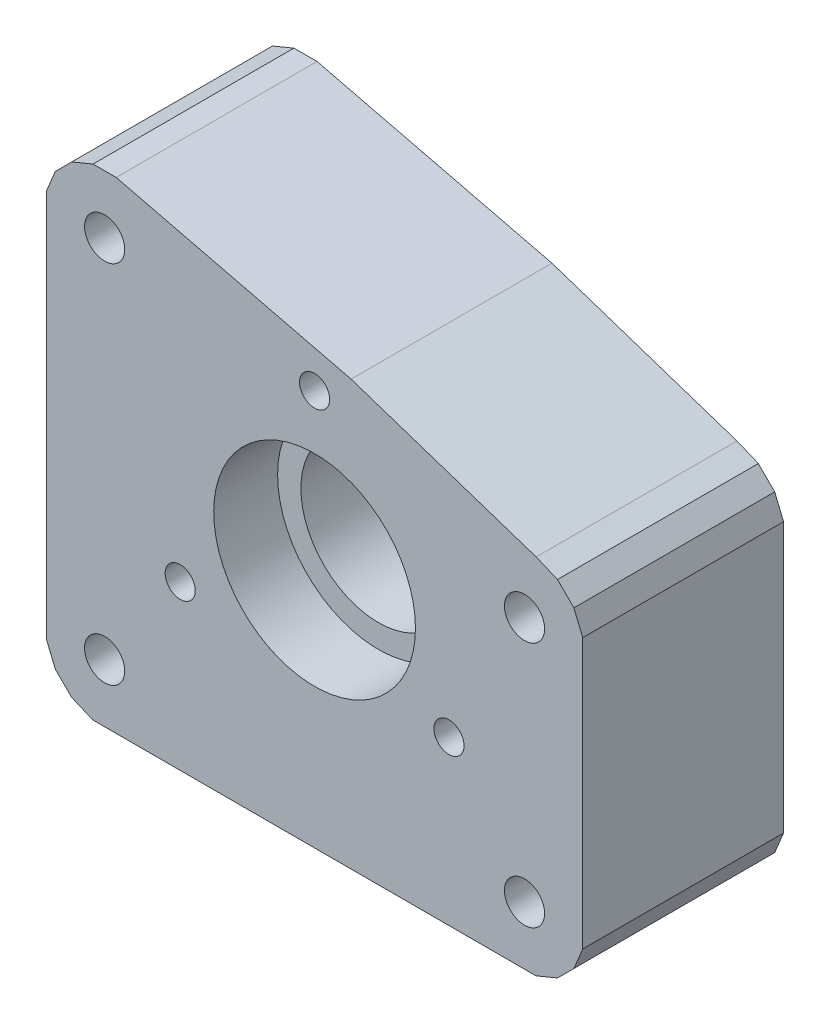
ISO-10303-21;
HEADER;
FILE_DESCRIPTION(('STEP AP214'),'2;1');
FILE_NAME('part.step','',(''),(''),'','','');
FILE_SCHEMA(('AUTOMOTIVE_DESIGN { 1 0 10303 214 1 1 1 1 }'));
ENDSEC;
DATA;
#1=APPLICATION_CONTEXT('core data for automotive mechanical design processes');
#2=APPLICATION_PROTOCOL_DEFINITION('international standard','automotive_design',2000,#1);
#3=PRODUCT_CONTEXT('',#1,'mechanical');
#4=PRODUCT('Part','Part','',(#3));
#5=PRODUCT_RELATED_PRODUCT_CATEGORY('part','',(#4));
#6=PRODUCT_DEFINITION_FORMATION('','',#4);
#7=PRODUCT_DEFINITION_CONTEXT('part definition',#1,'design');
#8=PRODUCT_DEFINITION('design','',#6,#7);
#9=PRODUCT_DEFINITION_SHAPE('','',#8);
#10=(LENGTH_UNIT() NAMED_UNIT(*) SI_UNIT(.MILLI.,.METRE.));
#11=(NAMED_UNIT(*) PLANE_ANGLE_UNIT() SI_UNIT($,.RADIAN.));
#12=(NAMED_UNIT(*) SI_UNIT($,.STERADIAN.) SOLID_ANGLE_UNIT());
#13=UNCERTAINTY_MEASURE_WITH_UNIT(LENGTH_MEASURE(1.E-05),#10,'distance_accuracy_value','');
#14=(GEOMETRIC_REPRESENTATION_CONTEXT(3) GLOBAL_UNCERTAINTY_ASSIGNED_CONTEXT((#13)) GLOBAL_UNIT_ASSIGNED_CONTEXT((#10,
#11,#12)) REPRESENTATION_CONTEXT('',''));
#15=CARTESIAN_POINT('',(0.,0.,0.));
#16=DIRECTION('',(0.,0.,1.));
#17=DIRECTION('',(1.,0.,0.));
#18=AXIS2_PLACEMENT_3D('',#15,#16,#17);
#19=CARTESIAN_POINT('',(0.,0.,56.));
#20=DIRECTION('',(0.,0.,-1.));
#21=DIRECTION('',(-1.,0.,0.));
#22=AXIS2_PLACEMENT_3D('',#19,#20,#21);
#23=CYLINDRICAL_SURFACE('',#22,8.5);
#24=CARTESIAN_POINT('',(0.,0.,41.));
#25=DIRECTION('',(0.,0.,1.));
#26=DIRECTION('',(1.,0.,0.));
#27=AXIS2_PLACEMENT_3D('',#24,#25,#26);
#28=CIRCLE('',#27,8.5);
#29=CARTESIAN_POINT('',(8.5,0.,41.));
#30=VERTEX_POINT('',#29);
#31=EDGE_CURVE('E280',#30,#30,#28,.T.);
#32=ORIENTED_EDGE('',*,*,#31,.F.);
#33=EDGE_LOOP('',(#32));
#34=FACE_BOUND('',#33,.T.);
#35=CARTESIAN_POINT('',(0.,0.,49.));
#36=DIRECTION('',(0.,0.,1.));
#37=DIRECTION('',(1.,0.,0.));
#38=AXIS2_PLACEMENT_3D('',#35,#36,#37);
#39=CIRCLE('',#38,8.5);
#40=CARTESIAN_POINT('',(8.5,0.,49.));
#41=VERTEX_POINT('',#40);
#42=EDGE_CURVE('E287',#41,#41,#39,.T.);
#43=ORIENTED_EDGE('',*,*,#42,.T.);
#44=EDGE_LOOP('',(#43));
#45=FACE_BOUND('',#44,.T.);
#46=ADVANCED_FACE('F43',(#34,#45),#23,.F.);
#47=CARTESIAN_POINT('',(0.,0.,56.));
#48=DIRECTION('',(0.,0.,1.));
#49=DIRECTION('',(1.,0.,0.));
#50=AXIS2_PLACEMENT_3D('',#47,#48,#49);
#51=PLANE('',#50);
#52=CARTESIAN_POINT('',(0.,0.,56.));
#53=DIRECTION('',(0.,0.,1.));
#54=DIRECTION('',(1.,0.,0.));
#55=AXIS2_PLACEMENT_3D('',#52,#53,#54);
#56=CIRCLE('',#55,11.05);
#57=CARTESIAN_POINT('',(11.05,0.,56.));
#58=VERTEX_POINT('',#57);
#59=EDGE_CURVE('E47',#58,#58,#56,.F.);
#60=ORIENTED_EDGE('',*,*,#59,.T.);
#61=EDGE_LOOP('',(#60));
#62=FACE_BOUND('',#61,.T.);
#63=CARTESIAN_POINT('',(14.7224318643355,-8.5,56.));
#64=DIRECTION('',(0.,0.,1.));
#65=DIRECTION('',(1.,0.,0.));
#66=AXIS2_PLACEMENT_3D('',#63,#64,#65);
#67=CIRCLE('',#66,1.65);
#68=CARTESIAN_POINT('',(16.3724318643355,-8.5,56.));
#69=VERTEX_POINT('',#68);
#70=EDGE_CURVE('E306',#69,#69,#67,.T.);
#71=ORIENTED_EDGE('',*,*,#70,.F.);
#72=EDGE_LOOP('',(#71));
#73=FACE_BOUND('',#72,.T.);
#74=CARTESIAN_POINT('',(-23.,20.,56.));
#75=DIRECTION('',(0.,0.,1.));
#76=DIRECTION('',(1.,0.,0.));
#77=AXIS2_PLACEMENT_3D('',#74,#75,#76);
#78=CIRCLE('',#77,2.2);
#79=CARTESIAN_POINT('',(-20.8,20.,56.));
#80=VERTEX_POINT('',#79);
#81=EDGE_CURVE('E318',#80,#80,#78,.T.);
#82=ORIENTED_EDGE('',*,*,#81,.F.);
#83=EDGE_LOOP('',(#82));
#84=FACE_BOUND('',#83,.T.);
#85=CARTESIAN_POINT('',(-23.,-20.,56.));
#86=DIRECTION('',(0.,0.,1.));
#87=DIRECTION('',(1.,0.,0.));
#88=AXIS2_PLACEMENT_3D('',#85,#86,#87);
#89=CIRCLE('',#88,2.2);
#90=CARTESIAN_POINT('',(-20.8,-20.,56.));
#91=VERTEX_POINT('',#90);
#92=EDGE_CURVE('E330',#91,#91,#89,.T.);
#93=ORIENTED_EDGE('',*,*,#92,.F.);
#94=EDGE_LOOP('',(#93));
#95=FACE_BOUND('',#94,.T.);
#96=DIRECTION('',(0.923879532511286,0.382683432365091,0.));
#97=VECTOR('',#96,1.);
#98=CARTESIAN_POINT('',(24.2680870931048,-26.375104322621,56.));
#99=LINE('',#98,#97);
#100=CARTESIAN_POINT('',(24.2680870931048,-26.375104322621,56.));
#101=VERTEX_POINT('',#100);
#102=CARTESIAN_POINT('',(26.6112065146274,-25.4045524799665,56.));
#103=VERTEX_POINT('',#102);
#104=EDGE_CURVE('E238',#101,#103,#99,.T.);
#105=ORIENTED_EDGE('',*,*,#104,.T.);
#106=DIRECTION('',(0.707106781186548,0.707106781186547,0.));
#107=VECTOR('',#106,1.);
#108=CARTESIAN_POINT('',(26.6112065146274,-25.4045524799665,56.));
#109=LINE('',#108,#107);
#110=CARTESIAN_POINT('',(28.4045524799665,-23.6112065146274,56.));
#111=VERTEX_POINT('',#110);
#112=EDGE_CURVE('E135',#103,#111,#109,.T.);
#113=ORIENTED_EDGE('',*,*,#112,.T.);
#114=DIRECTION('',(0.382683432365089,0.923879532511287,0.));
#115=VECTOR('',#114,1.);
#116=CARTESIAN_POINT('',(28.4045524799665,-23.6112065146274,56.));
#117=LINE('',#116,#115);
#118=CARTESIAN_POINT('',(29.375104322621,-21.2680870931048,56.));
#119=VERTEX_POINT('',#118);
#120=EDGE_CURVE('E342',#111,#119,#117,.T.);
#121=ORIENTED_EDGE('',*,*,#120,.T.);
#122=DIRECTION('',(0.,1.,0.));
#123=VECTOR('',#122,1.);
#124=CARTESIAN_POINT('',(29.375104322621,-21.2680870931048,56.));
#125=LINE('',#124,#123);
#126=CARTESIAN_POINT('',(29.375104322621,8.26808709310483,56.));
#127=VERTEX_POINT('',#126);
#128=EDGE_CURVE('E344',#119,#127,#125,.T.);
#129=ORIENTED_EDGE('',*,*,#128,.T.);
#130=DIRECTION('',(-0.38268343236509,0.923879532511287,0.));
#131=VECTOR('',#130,1.);
#132=CARTESIAN_POINT('',(29.375104322621,8.26808709310483,56.));
#133=LINE('',#132,#131);
#134=CARTESIAN_POINT('',(28.4045524799665,10.6112065146274,56.));
#135=VERTEX_POINT('',#134);
#136=EDGE_CURVE('E346',#127,#135,#133,.T.);
#137=ORIENTED_EDGE('',*,*,#136,.T.);
#138=DIRECTION('',(-0.707106781186547,0.707106781186547,0.));
#139=VECTOR('',#138,1.);
#140=CARTESIAN_POINT('',(28.4045524799665,10.6112065146274,56.));
#141=LINE('',#140,#139);
#142=CARTESIAN_POINT('',(26.6112065146274,12.4045524799665,56.));
#143=VERTEX_POINT('',#142);
#144=EDGE_CURVE('E348',#135,#143,#141,.T.);
#145=ORIENTED_EDGE('',*,*,#144,.T.);
#146=DIRECTION('',(-0.923879532511287,0.382683432365089,0.));
#147=VECTOR('',#146,1.);
#148=CARTESIAN_POINT('',(26.6112065146274,12.4045524799665,56.));
#149=LINE('',#148,#147);
#150=CARTESIAN_POINT('',(24.2680870931048,13.375104322621,56.));
#151=VERTEX_POINT('',#150);
#152=EDGE_CURVE('E350',#143,#151,#149,.T.);
#153=ORIENTED_EDGE('',*,*,#152,.T.);
#154=DIRECTION('',(-0.949037400798364,0.315163468514175,0.));
#155=VECTOR('',#154,1.);
#156=CARTESIAN_POINT('',(24.2680870931048,13.375104322621,56.));
#157=LINE('',#156,#155);
#158=CARTESIAN_POINT('',(3.99935160133063,20.1060982482662,56.));
#159=VERTEX_POINT('',#158);
#160=EDGE_CURVE('E352',#151,#159,#157,.T.);
#161=ORIENTED_EDGE('',*,*,#160,.T.);
#162=DIRECTION('',(-0.971580389978421,0.236709834627504,0.));
#163=VECTOR('',#162,1.);
#164=CARTESIAN_POINT('',(3.99935160133063,20.1060982482662,56.));
#165=LINE('',#164,#163);
#166=CARTESIAN_POINT('',(-21.7319129068952,26.375104322621,56.));
#167=VERTEX_POINT('',#166);
#168=EDGE_CURVE('E354',#159,#167,#165,.T.);
#169=ORIENTED_EDGE('',*,*,#168,.T.);
#170=DIRECTION('',(-1.,0.,0.));
#171=VECTOR('',#170,1.);
#172=CARTESIAN_POINT('',(-21.7319129068952,26.375104322621,56.));
#173=LINE('',#172,#171);
#174=CARTESIAN_POINT('',(-24.2680870931048,26.375104322621,56.));
#175=VERTEX_POINT('',#174);
#176=EDGE_CURVE('E356',#167,#175,#173,.T.);
#177=ORIENTED_EDGE('',*,*,#176,.T.);
#178=DIRECTION('',(-0.923879532511286,-0.382683432365091,0.));
#179=VECTOR('',#178,1.);
#180=CARTESIAN_POINT('',(-24.2680870931048,26.375104322621,56.));
#181=LINE('',#180,#179);
#182=CARTESIAN_POINT('',(-26.6112065146274,25.4045524799665,56.));
#183=VERTEX_POINT('',#182);
#184=EDGE_CURVE('E358',#175,#183,#181,.T.);
#185=ORIENTED_EDGE('',*,*,#184,.T.);
#186=DIRECTION('',(-0.707106781186548,-0.707106781186547,0.));
#187=VECTOR('',#186,1.);
#188=CARTESIAN_POINT('',(-26.6112065146274,25.4045524799665,56.));
#189=LINE('',#188,#187);
#190=CARTESIAN_POINT('',(-28.4045524799665,23.6112065146274,56.));
#191=VERTEX_POINT('',#190);
#192=EDGE_CURVE('E360',#183,#191,#189,.T.);
#193=ORIENTED_EDGE('',*,*,#192,.T.);
#194=DIRECTION('',(-0.382683432365089,-0.923879532511287,0.));
#195=VECTOR('',#194,1.);
#196=CARTESIAN_POINT('',(-28.4045524799665,23.6112065146274,56.));
#197=LINE('',#196,#195);
#198=CARTESIAN_POINT('',(-29.375104322621,21.2680870931048,56.));
#199=VERTEX_POINT('',#198);
#200=EDGE_CURVE('E362',#191,#199,#197,.T.);
#201=ORIENTED_EDGE('',*,*,#200,.T.);
#202=DIRECTION('',(0.,-1.,0.));
#203=VECTOR('',#202,1.);
#204=CARTESIAN_POINT('',(-29.375104322621,21.2680870931048,56.));
#205=LINE('',#204,#203);
#206=CARTESIAN_POINT('',(-29.375104322621,-21.2680870931048,56.));
#207=VERTEX_POINT('',#206);
#208=EDGE_CURVE('E364',#199,#207,#205,.T.);
#209=ORIENTED_EDGE('',*,*,#208,.T.);
#210=DIRECTION('',(0.382683432365089,-0.923879532511287,0.));
#211=VECTOR('',#210,1.);
#212=CARTESIAN_POINT('',(-29.375104322621,-21.2680870931048,56.));
#213=LINE('',#212,#211);
#214=CARTESIAN_POINT('',(-28.4045524799665,-23.6112065146274,56.));
#215=VERTEX_POINT('',#214);
#216=EDGE_CURVE('E185',#207,#215,#213,.T.);
#217=ORIENTED_EDGE('',*,*,#216,.T.);
#218=DIRECTION('',(0.707106781186548,-0.707106781186547,0.));
#219=VECTOR('',#218,1.);
#220=CARTESIAN_POINT('',(-28.4045524799665,-23.6112065146274,56.));
#221=LINE('',#220,#219);
#222=CARTESIAN_POINT('',(-26.6112065146274,-25.4045524799665,56.));
#223=VERTEX_POINT('',#222);
#224=EDGE_CURVE('E178',#215,#223,#221,.T.);
#225=ORIENTED_EDGE('',*,*,#224,.T.);
#226=DIRECTION('',(0.923879532511287,-0.38268343236509,0.));
#227=VECTOR('',#226,1.);
#228=CARTESIAN_POINT('',(-26.6112065146274,-25.4045524799665,56.));
#229=LINE('',#228,#227);
#230=CARTESIAN_POINT('',(-24.2680870931048,-26.375104322621,56.));
#231=VERTEX_POINT('',#230);
#232=EDGE_CURVE('E183',#223,#231,#229,.T.);
#233=ORIENTED_EDGE('',*,*,#232,.T.);
#234=DIRECTION('',(1.,0.,0.));
#235=VECTOR('',#234,1.);
#236=CARTESIAN_POINT('',(-24.2680870931048,-26.375104322621,56.));
#237=LINE('',#236,#235);
#238=EDGE_CURVE('E62',#231,#101,#237,.T.);
#239=ORIENTED_EDGE('',*,*,#238,.T.);
#240=EDGE_LOOP('',(#105,#113,#121,#129,#137,#145,#153,#161,#169,#177,#185,#193,#201,#209,#217,
#225,#233,#239));
#241=FACE_BOUND('',#240,.T.);
#242=CARTESIAN_POINT('',(23.,-20.,56.));
#243=DIRECTION('',(0.,0.,1.));
#244=DIRECTION('',(1.,0.,0.));
#245=AXIS2_PLACEMENT_3D('',#242,#243,#244);
#246=CIRCLE('',#245,2.2);
#247=CARTESIAN_POINT('',(25.2,-20.,56.));
#248=VERTEX_POINT('',#247);
#249=EDGE_CURVE('E207',#248,#248,#246,.T.);
#250=ORIENTED_EDGE('',*,*,#249,.F.);
#251=EDGE_LOOP('',(#250));
#252=FACE_BOUND('',#251,.T.);
#253=CARTESIAN_POINT('',(23.,7.,56.));
#254=DIRECTION('',(0.,0.,1.));
#255=DIRECTION('',(1.,0.,0.));
#256=AXIS2_PLACEMENT_3D('',#253,#254,#255);
#257=CIRCLE('',#256,2.2);
#258=CARTESIAN_POINT('',(25.2,7.,56.));
#259=VERTEX_POINT('',#258);
#260=EDGE_CURVE('E324',#259,#259,#257,.T.);
#261=ORIENTED_EDGE('',*,*,#260,.F.);
#262=EDGE_LOOP('',(#261));
#263=FACE_BOUND('',#262,.T.);
#264=CARTESIAN_POINT('',(0.,17.,56.));
#265=DIRECTION('',(0.,0.,1.));
#266=DIRECTION('',(1.,0.,0.));
#267=AXIS2_PLACEMENT_3D('',#264,#265,#266);
#268=CIRCLE('',#267,1.65);
#269=CARTESIAN_POINT('',(1.65,17.,56.));
#270=VERTEX_POINT('',#269);
#271=EDGE_CURVE('E312',#270,#270,#268,.T.);
#272=ORIENTED_EDGE('',*,*,#271,.F.);
#273=EDGE_LOOP('',(#272));
#274=FACE_BOUND('',#273,.T.);
#275=CARTESIAN_POINT('',(-14.7224318643355,-8.50000000000001,56.));
#276=DIRECTION('',(0.,0.,1.));
#277=DIRECTION('',(1.,0.,0.));
#278=AXIS2_PLACEMENT_3D('',#275,#276,#277);
#279=CIRCLE('',#278,1.65);
#280=CARTESIAN_POINT('',(-13.0724318643355,-8.50000000000001,56.));
#281=VERTEX_POINT('',#280);
#282=EDGE_CURVE('E300',#281,#281,#279,.T.);
#283=ORIENTED_EDGE('',*,*,#282,.F.);
#284=EDGE_LOOP('',(#283));
#285=FACE_BOUND('',#284,.T.);
#286=ADVANCED_FACE('F180',(#62,#73,#84,#95,#241,#252,#263,#274,#285),#51,.T.);
#287=CARTESIAN_POINT('',(0.,0.,34.));
#288=DIRECTION('',(0.,0.,1.));
#289=DIRECTION('',(1.,0.,0.));
#290=AXIS2_PLACEMENT_3D('',#287,#288,#289);
#291=PLANE('',#290);
#292=CARTESIAN_POINT('',(0.,0.,34.));
#293=DIRECTION('',(0.,0.,1.));
#294=DIRECTION('',(1.,0.,0.));
#295=AXIS2_PLACEMENT_3D('',#292,#293,#294);
#296=CIRCLE('',#295,11.05);
#297=CARTESIAN_POINT('',(11.05,0.,34.));
#298=VERTEX_POINT('',#297);
#299=EDGE_CURVE('E283',#298,#298,#296,.F.);
#300=ORIENTED_EDGE('',*,*,#299,.F.);
#301=EDGE_LOOP('',(#300));
#302=FACE_BOUND('',#301,.T.);
#303=DIRECTION('',(0.923879532511286,0.382683432365091,0.));
#304=VECTOR('',#303,1.);
#305=CARTESIAN_POINT('',(24.2680870931048,-26.375104322621,34.));
#306=LINE('',#305,#304);
#307=CARTESIAN_POINT('',(24.2680870931048,-26.375104322621,34.));
#308=VERTEX_POINT('',#307);
#309=CARTESIAN_POINT('',(26.6112065146274,-25.4045524799665,34.));
#310=VERTEX_POINT('',#309);
#311=EDGE_CURVE('E203',#308,#310,#306,.T.);
#312=ORIENTED_EDGE('',*,*,#311,.F.);
#313=DIRECTION('',(1.,0.,0.));
#314=VECTOR('',#313,1.);
#315=CARTESIAN_POINT('',(-24.2680870931048,-26.375104322621,34.));
#316=LINE('',#315,#314);
#317=CARTESIAN_POINT('',(-24.2680870931048,-26.375104322621,34.));
#318=VERTEX_POINT('',#317);
#319=EDGE_CURVE('E127',#318,#308,#316,.T.);
#320=ORIENTED_EDGE('',*,*,#319,.F.);
#321=DIRECTION('',(0.923879532511287,-0.38268343236509,0.));
#322=VECTOR('',#321,1.);
#323=CARTESIAN_POINT('',(-26.6112065146274,-25.4045524799665,34.));
#324=LINE('',#323,#322);
#325=CARTESIAN_POINT('',(-26.6112065146274,-25.4045524799665,34.));
#326=VERTEX_POINT('',#325);
#327=EDGE_CURVE('E121',#326,#318,#324,.T.);
#328=ORIENTED_EDGE('',*,*,#327,.F.);
#329=DIRECTION('',(0.707106781186548,-0.707106781186547,0.));
#330=VECTOR('',#329,1.);
#331=CARTESIAN_POINT('',(-28.4045524799665,-23.6112065146274,34.));
#332=LINE('',#331,#330);
#333=CARTESIAN_POINT('',(-28.4045524799665,-23.6112065146274,34.));
#334=VERTEX_POINT('',#333);
#335=EDGE_CURVE('E193',#334,#326,#332,.T.);
#336=ORIENTED_EDGE('',*,*,#335,.F.);
#337=DIRECTION('',(0.382683432365089,-0.923879532511287,0.));
#338=VECTOR('',#337,1.);
#339=CARTESIAN_POINT('',(-29.375104322621,-21.2680870931048,34.));
#340=LINE('',#339,#338);
#341=CARTESIAN_POINT('',(-29.375104322621,-21.2680870931048,34.));
#342=VERTEX_POINT('',#341);
#343=EDGE_CURVE('E233',#342,#334,#340,.T.);
#344=ORIENTED_EDGE('',*,*,#343,.F.);
#345=DIRECTION('',(0.,-1.,0.));
#346=VECTOR('',#345,1.);
#347=CARTESIAN_POINT('',(-29.375104322621,21.2680870931048,34.));
#348=LINE('',#347,#346);
#349=CARTESIAN_POINT('',(-29.375104322621,21.2680870931048,34.));
#350=VERTEX_POINT('',#349);
#351=EDGE_CURVE('E231',#350,#342,#348,.T.);
#352=ORIENTED_EDGE('',*,*,#351,.F.);
#353=DIRECTION('',(-0.382683432365089,-0.923879532511287,0.));
#354=VECTOR('',#353,1.);
#355=CARTESIAN_POINT('',(-28.4045524799665,23.6112065146274,34.));
#356=LINE('',#355,#354);
#357=CARTESIAN_POINT('',(-28.4045524799665,23.6112065146274,34.));
#358=VERTEX_POINT('',#357);
#359=EDGE_CURVE('E229',#358,#350,#356,.T.);
#360=ORIENTED_EDGE('',*,*,#359,.F.);
#361=DIRECTION('',(-0.707106781186548,-0.707106781186547,0.));
#362=VECTOR('',#361,1.);
#363=CARTESIAN_POINT('',(-26.6112065146274,25.4045524799665,34.));
#364=LINE('',#363,#362);
#365=CARTESIAN_POINT('',(-26.6112065146274,25.4045524799665,34.));
#366=VERTEX_POINT('',#365);
#367=EDGE_CURVE('E227',#366,#358,#364,.T.);
#368=ORIENTED_EDGE('',*,*,#367,.F.);
#369=DIRECTION('',(-0.923879532511286,-0.382683432365091,0.));
#370=VECTOR('',#369,1.);
#371=CARTESIAN_POINT('',(-24.2680870931048,26.375104322621,34.));
#372=LINE('',#371,#370);
#373=CARTESIAN_POINT('',(-24.2680870931048,26.375104322621,34.));
#374=VERTEX_POINT('',#373);
#375=EDGE_CURVE('E225',#374,#366,#372,.T.);
#376=ORIENTED_EDGE('',*,*,#375,.F.);
#377=DIRECTION('',(-1.,0.,0.));
#378=VECTOR('',#377,1.);
#379=CARTESIAN_POINT('',(-21.7319129068952,26.375104322621,34.));
#380=LINE('',#379,#378);
#381=CARTESIAN_POINT('',(-21.7319129068952,26.375104322621,34.));
#382=VERTEX_POINT('',#381);
#383=EDGE_CURVE('E223',#382,#374,#380,.T.);
#384=ORIENTED_EDGE('',*,*,#383,.F.);
#385=DIRECTION('',(-0.971580389978421,0.236709834627504,0.));
#386=VECTOR('',#385,1.);
#387=CARTESIAN_POINT('',(3.99935160133063,20.1060982482662,34.));
#388=LINE('',#387,#386);
#389=CARTESIAN_POINT('',(3.99935160133063,20.1060982482662,34.));
#390=VERTEX_POINT('',#389);
#391=EDGE_CURVE('E221',#390,#382,#388,.T.);
#392=ORIENTED_EDGE('',*,*,#391,.F.);
#393=DIRECTION('',(-0.949037400798364,0.315163468514175,0.));
#394=VECTOR('',#393,1.);
#395=CARTESIAN_POINT('',(24.2680870931048,13.375104322621,34.));
#396=LINE('',#395,#394);
#397=CARTESIAN_POINT('',(24.2680870931048,13.375104322621,34.));
#398=VERTEX_POINT('',#397);
#399=EDGE_CURVE('E219',#398,#390,#396,.T.);
#400=ORIENTED_EDGE('',*,*,#399,.F.);
#401=DIRECTION('',(-0.923879532511287,0.382683432365089,0.));
#402=VECTOR('',#401,1.);
#403=CARTESIAN_POINT('',(26.6112065146274,12.4045524799665,34.));
#404=LINE('',#403,#402);
#405=CARTESIAN_POINT('',(26.6112065146274,12.4045524799665,34.));
#406=VERTEX_POINT('',#405);
#407=EDGE_CURVE('E217',#406,#398,#404,.T.);
#408=ORIENTED_EDGE('',*,*,#407,.F.);
#409=DIRECTION('',(-0.707106781186547,0.707106781186547,0.));
#410=VECTOR('',#409,1.);
#411=CARTESIAN_POINT('',(28.4045524799665,10.6112065146274,34.));
#412=LINE('',#411,#410);
#413=CARTESIAN_POINT('',(28.4045524799665,10.6112065146274,34.));
#414=VERTEX_POINT('',#413);
#415=EDGE_CURVE('E215',#414,#406,#412,.T.);
#416=ORIENTED_EDGE('',*,*,#415,.F.);
#417=DIRECTION('',(-0.38268343236509,0.923879532511287,0.));
#418=VECTOR('',#417,1.);
#419=CARTESIAN_POINT('',(29.375104322621,8.26808709310483,34.));
#420=LINE('',#419,#418);
#421=CARTESIAN_POINT('',(29.375104322621,8.26808709310483,34.));
#422=VERTEX_POINT('',#421);
#423=EDGE_CURVE('E213',#422,#414,#420,.T.);
#424=ORIENTED_EDGE('',*,*,#423,.F.);
#425=DIRECTION('',(0.,1.,0.));
#426=VECTOR('',#425,1.);
#427=CARTESIAN_POINT('',(29.375104322621,-21.2680870931048,34.));
#428=LINE('',#427,#426);
#429=CARTESIAN_POINT('',(29.375104322621,-21.2680870931048,34.));
#430=VERTEX_POINT('',#429);
#431=EDGE_CURVE('E211',#430,#422,#428,.T.);
#432=ORIENTED_EDGE('',*,*,#431,.F.);
#433=DIRECTION('',(0.382683432365089,0.923879532511287,0.));
#434=VECTOR('',#433,1.);
#435=CARTESIAN_POINT('',(28.4045524799665,-23.6112065146274,34.));
#436=LINE('',#435,#434);
#437=CARTESIAN_POINT('',(28.4045524799665,-23.6112065146274,34.));
#438=VERTEX_POINT('',#437);
#439=EDGE_CURVE('E209',#438,#430,#436,.T.);
#440=ORIENTED_EDGE('',*,*,#439,.F.);
#441=DIRECTION('',(0.707106781186548,0.707106781186547,0.));
#442=VECTOR('',#441,1.);
#443=CARTESIAN_POINT('',(26.6112065146274,-25.4045524799665,34.));
#444=LINE('',#443,#442);
#445=EDGE_CURVE('E206',#310,#438,#444,.T.);
#446=ORIENTED_EDGE('',*,*,#445,.F.);
#447=EDGE_LOOP('',(#312,#320,#328,#336,#344,#352,#360,#368,#376,#384,#392,#400,#408,#416,#424,
#432,#440,#446));
#448=FACE_BOUND('',#447,.T.);
#449=CARTESIAN_POINT('',(23.,-20.,34.));
#450=DIRECTION('',(0.,0.,1.));
#451=DIRECTION('',(1.,0.,0.));
#452=AXIS2_PLACEMENT_3D('',#449,#450,#451);
#453=CIRCLE('',#452,2.2);
#454=CARTESIAN_POINT('',(25.2,-20.,34.));
#455=VERTEX_POINT('',#454);
#456=EDGE_CURVE('E333',#455,#455,#453,.T.);
#457=ORIENTED_EDGE('',*,*,#456,.T.);
#458=EDGE_LOOP('',(#457));
#459=FACE_BOUND('',#458,.T.);
#460=CARTESIAN_POINT('',(-23.,-20.,34.));
#461=DIRECTION('',(0.,0.,1.));
#462=DIRECTION('',(1.,0.,0.));
#463=AXIS2_PLACEMENT_3D('',#460,#461,#462);
#464=CIRCLE('',#463,2.2);
#465=CARTESIAN_POINT('',(-20.8,-20.,34.));
#466=VERTEX_POINT('',#465);
#467=EDGE_CURVE('E327',#466,#466,#464,.T.);
#468=ORIENTED_EDGE('',*,*,#467,.T.);
#469=EDGE_LOOP('',(#468));
#470=FACE_BOUND('',#469,.T.);
#471=CARTESIAN_POINT('',(23.,7.,34.));
#472=DIRECTION('',(0.,0.,1.));
#473=DIRECTION('',(1.,0.,0.));
#474=AXIS2_PLACEMENT_3D('',#471,#472,#473);
#475=CIRCLE('',#474,2.2);
#476=CARTESIAN_POINT('',(25.2,7.,34.));
#477=VERTEX_POINT('',#476);
#478=EDGE_CURVE('E321',#477,#477,#475,.T.);
#479=ORIENTED_EDGE('',*,*,#478,.T.);
#480=EDGE_LOOP('',(#479));
#481=FACE_BOUND('',#480,.T.);
#482=CARTESIAN_POINT('',(-23.,20.,34.));
#483=DIRECTION('',(0.,0.,1.));
#484=DIRECTION('',(1.,0.,0.));
#485=AXIS2_PLACEMENT_3D('',#482,#483,#484);
#486=CIRCLE('',#485,2.2);
#487=CARTESIAN_POINT('',(-20.8,20.,34.));
#488=VERTEX_POINT('',#487);
#489=EDGE_CURVE('E315',#488,#488,#486,.T.);
#490=ORIENTED_EDGE('',*,*,#489,.T.);
#491=EDGE_LOOP('',(#490));
#492=FACE_BOUND('',#491,.T.);
#493=CARTESIAN_POINT('',(0.,17.,34.));
#494=DIRECTION('',(0.,0.,1.));
#495=DIRECTION('',(1.,0.,0.));
#496=AXIS2_PLACEMENT_3D('',#493,#494,#495);
#497=CIRCLE('',#496,1.65);
#498=CARTESIAN_POINT('',(1.65,17.,34.));
#499=VERTEX_POINT('',#498);
#500=EDGE_CURVE('E309',#499,#499,#497,.T.);
#501=ORIENTED_EDGE('',*,*,#500,.T.);
#502=EDGE_LOOP('',(#501));
#503=FACE_BOUND('',#502,.T.);
#504=CARTESIAN_POINT('',(14.7224318643355,-8.5,34.));
#505=DIRECTION('',(0.,0.,1.));
#506=DIRECTION('',(1.,0.,0.));
#507=AXIS2_PLACEMENT_3D('',#504,#505,#506);
#508=CIRCLE('',#507,1.65);
#509=CARTESIAN_POINT('',(16.3724318643355,-8.5,34.));
#510=VERTEX_POINT('',#509);
#511=EDGE_CURVE('E303',#510,#510,#508,.T.);
#512=ORIENTED_EDGE('',*,*,#511,.T.);
#513=EDGE_LOOP('',(#512));
#514=FACE_BOUND('',#513,.T.);
#515=CARTESIAN_POINT('',(-14.7224318643355,-8.50000000000001,34.));
#516=DIRECTION('',(0.,0.,1.));
#517=DIRECTION('',(1.,0.,0.));
#518=AXIS2_PLACEMENT_3D('',#515,#516,#517);
#519=CIRCLE('',#518,1.65);
#520=CARTESIAN_POINT('',(-13.0724318643355,-8.50000000000001,34.));
#521=VERTEX_POINT('',#520);
#522=EDGE_CURVE('E286',#521,#521,#519,.T.);
#523=ORIENTED_EDGE('',*,*,#522,.T.);
#524=EDGE_LOOP('',(#523));
#525=FACE_BOUND('',#524,.T.);
#526=ADVANCED_FACE('F377',(#302,#448,#459,#470,#481,#492,#503,#514,#525),#291,.F.);
#527=CARTESIAN_POINT('',(24.2680870931048,-26.375104322621,56.));
#528=DIRECTION('',(-0.382683432365091,0.923879532511286,0.));
#529=DIRECTION('',(-0.923879532511286,-0.382683432365091,0.));
#530=AXIS2_PLACEMENT_3D('',#527,#528,#529);
#531=PLANE('',#530);
#532=ORIENTED_EDGE('',*,*,#311,.T.);
#533=DIRECTION('',(0.,0.,-1.));
#534=VECTOR('',#533,1.);
#535=CARTESIAN_POINT('',(26.6112065146274,-25.4045524799665,56.));
#536=LINE('',#535,#534);
#537=EDGE_CURVE('E11',#103,#310,#536,.T.);
#538=ORIENTED_EDGE('',*,*,#537,.F.);
#539=ORIENTED_EDGE('',*,*,#104,.F.);
#540=DIRECTION('',(0.,0.,-1.));
#541=VECTOR('',#540,1.);
#542=CARTESIAN_POINT('',(24.2680870931048,-26.375104322621,56.));
#543=LINE('',#542,#541);
#544=EDGE_CURVE('E199',#101,#308,#543,.T.);
#545=ORIENTED_EDGE('',*,*,#544,.T.);
#546=EDGE_LOOP('',(#532,#538,#539,#545));
#547=FACE_BOUND('',#546,.T.);
#548=ADVANCED_FACE('F45',(#547),#531,.F.);
#549=CARTESIAN_POINT('',(26.6112065146274,-25.4045524799665,56.));
#550=DIRECTION('',(-0.707106781186547,0.707106781186548,0.));
#551=DIRECTION('',(-0.707106781186548,-0.707106781186547,0.));
#552=AXIS2_PLACEMENT_3D('',#549,#550,#551);
#553=PLANE('',#552);
#554=ORIENTED_EDGE('',*,*,#445,.T.);
#555=DIRECTION('',(0.,0.,-1.));
#556=VECTOR('',#555,1.);
#557=CARTESIAN_POINT('',(28.4045524799665,-23.6112065146274,56.));
#558=LINE('',#557,#556);
#559=EDGE_CURVE('E53',#111,#438,#558,.T.);
#560=ORIENTED_EDGE('',*,*,#559,.F.);
#561=ORIENTED_EDGE('',*,*,#112,.F.);
#562=ORIENTED_EDGE('',*,*,#537,.T.);
#563=EDGE_LOOP('',(#554,#560,#561,#562));
#564=FACE_BOUND('',#563,.T.);
#565=ADVANCED_FACE('F414',(#564),#553,.F.);
#566=CARTESIAN_POINT('',(28.4045524799665,-23.6112065146274,56.));
#567=DIRECTION('',(-0.923879532511287,0.382683432365089,0.));
#568=DIRECTION('',(-0.382683432365089,-0.923879532511287,0.));
#569=AXIS2_PLACEMENT_3D('',#566,#567,#568);
#570=PLANE('',#569);
#571=ORIENTED_EDGE('',*,*,#439,.T.);
#572=DIRECTION('',(0.,0.,-1.));
#573=VECTOR('',#572,1.);
#574=CARTESIAN_POINT('',(29.375104322621,-21.2680870931048,56.));
#575=LINE('',#574,#573);
#576=EDGE_CURVE('E275',#119,#430,#575,.T.);
#577=ORIENTED_EDGE('',*,*,#576,.F.);
#578=ORIENTED_EDGE('',*,*,#120,.F.);
#579=ORIENTED_EDGE('',*,*,#559,.T.);
#580=EDGE_LOOP('',(#571,#577,#578,#579));
#581=FACE_BOUND('',#580,.T.);
#582=ADVANCED_FACE('F555',(#581),#570,.F.);
#583=CARTESIAN_POINT('',(29.375104322621,-21.2680870931048,56.));
#584=DIRECTION('',(-1.,0.,0.));
#585=DIRECTION('',(0.,0.,1.));
#586=AXIS2_PLACEMENT_3D('',#583,#584,#585);
#587=PLANE('',#586);
#588=ORIENTED_EDGE('',*,*,#431,.T.);
#589=DIRECTION('',(0.,0.,-1.));
#590=VECTOR('',#589,1.);
#591=CARTESIAN_POINT('',(29.375104322621,8.26808709310483,56.));
#592=LINE('',#591,#590);
#593=EDGE_CURVE('E272',#127,#422,#592,.T.);
#594=ORIENTED_EDGE('',*,*,#593,.F.);
#595=ORIENTED_EDGE('',*,*,#128,.F.);
#596=ORIENTED_EDGE('',*,*,#576,.T.);
#597=EDGE_LOOP('',(#588,#594,#595,#596));
#598=FACE_BOUND('',#597,.T.);
#599=ADVANCED_FACE('F563',(#598),#587,.F.);
#600=CARTESIAN_POINT('',(29.375104322621,8.26808709310483,56.));
#601=DIRECTION('',(-0.923879532511287,-0.38268343236509,0.));
#602=DIRECTION('',(0.38268343236509,-0.923879532511287,0.));
#603=AXIS2_PLACEMENT_3D('',#600,#601,#602);
#604=PLANE('',#603);
#605=ORIENTED_EDGE('',*,*,#423,.T.);
#606=DIRECTION('',(0.,0.,-1.));
#607=VECTOR('',#606,1.);
#608=CARTESIAN_POINT('',(28.4045524799665,10.6112065146274,56.));
#609=LINE('',#608,#607);
#610=EDGE_CURVE('E269',#135,#414,#609,.T.);
#611=ORIENTED_EDGE('',*,*,#610,.F.);
#612=ORIENTED_EDGE('',*,*,#136,.F.);
#613=ORIENTED_EDGE('',*,*,#593,.T.);
#614=EDGE_LOOP('',(#605,#611,#612,#613));
#615=FACE_BOUND('',#614,.T.);
#616=ADVANCED_FACE('F573',(#615),#604,.F.);
#617=CARTESIAN_POINT('',(28.4045524799665,10.6112065146274,56.));
#618=DIRECTION('',(-0.707106781186548,-0.707106781186548,0.));
#619=DIRECTION('',(0.707106781186548,-0.707106781186548,0.));
#620=AXIS2_PLACEMENT_3D('',#617,#618,#619);
#621=PLANE('',#620);
#622=ORIENTED_EDGE('',*,*,#415,.T.);
#623=DIRECTION('',(0.,0.,-1.));
#624=VECTOR('',#623,1.);
#625=CARTESIAN_POINT('',(26.6112065146274,12.4045524799665,56.));
#626=LINE('',#625,#624);
#627=EDGE_CURVE('E266',#143,#406,#626,.T.);
#628=ORIENTED_EDGE('',*,*,#627,.F.);
#629=ORIENTED_EDGE('',*,*,#144,.F.);
#630=ORIENTED_EDGE('',*,*,#610,.T.);
#631=EDGE_LOOP('',(#622,#628,#629,#630));
#632=FACE_BOUND('',#631,.T.);
#633=ADVANCED_FACE('F583',(#632),#621,.F.);
#634=CARTESIAN_POINT('',(26.6112065146274,12.4045524799665,56.));
#635=DIRECTION('',(-0.38268343236509,-0.923879532511287,0.));
#636=DIRECTION('',(0.923879532511287,-0.38268343236509,0.));
#637=AXIS2_PLACEMENT_3D('',#634,#635,#636);
#638=PLANE('',#637);
#639=ORIENTED_EDGE('',*,*,#407,.T.);
#640=DIRECTION('',(0.,0.,-1.));
#641=VECTOR('',#640,1.);
#642=CARTESIAN_POINT('',(24.2680870931048,13.375104322621,56.));
#643=LINE('',#642,#641);
#644=EDGE_CURVE('E263',#151,#398,#643,.T.);
#645=ORIENTED_EDGE('',*,*,#644,.F.);
#646=ORIENTED_EDGE('',*,*,#152,.F.);
#647=ORIENTED_EDGE('',*,*,#627,.T.);
#648=EDGE_LOOP('',(#639,#645,#646,#647));
#649=FACE_BOUND('',#648,.T.);
#650=ADVANCED_FACE('F593',(#649),#638,.F.);
#651=CARTESIAN_POINT('',(24.2680870931048,13.375104322621,56.));
#652=DIRECTION('',(-0.315163468514175,-0.949037400798364,0.));
#653=DIRECTION('',(0.949037400798364,-0.315163468514175,0.));
#654=AXIS2_PLACEMENT_3D('',#651,#652,#653);
#655=PLANE('',#654);
#656=ORIENTED_EDGE('',*,*,#399,.T.);
#657=DIRECTION('',(0.,0.,-1.));
#658=VECTOR('',#657,1.);
#659=CARTESIAN_POINT('',(3.99935160133063,20.1060982482662,56.));
#660=LINE('',#659,#658);
#661=EDGE_CURVE('E260',#159,#390,#660,.T.);
#662=ORIENTED_EDGE('',*,*,#661,.F.);
#663=ORIENTED_EDGE('',*,*,#160,.F.);
#664=ORIENTED_EDGE('',*,*,#644,.T.);
#665=EDGE_LOOP('',(#656,#662,#663,#664));
#666=FACE_BOUND('',#665,.T.);
#667=ADVANCED_FACE('F603',(#666),#655,.F.);
#668=CARTESIAN_POINT('',(3.99935160133063,20.1060982482662,56.));
#669=DIRECTION('',(-0.236709834627504,-0.971580389978421,0.));
#670=DIRECTION('',(0.971580389978421,-0.236709834627504,0.));
#671=AXIS2_PLACEMENT_3D('',#668,#669,#670);
#672=PLANE('',#671);
#673=ORIENTED_EDGE('',*,*,#391,.T.);
#674=DIRECTION('',(0.,0.,-1.));
#675=VECTOR('',#674,1.);
#676=CARTESIAN_POINT('',(-21.7319129068952,26.375104322621,56.));
#677=LINE('',#676,#675);
#678=EDGE_CURVE('E257',#167,#382,#677,.T.);
#679=ORIENTED_EDGE('',*,*,#678,.F.);
#680=ORIENTED_EDGE('',*,*,#168,.F.);
#681=ORIENTED_EDGE('',*,*,#661,.T.);
#682=EDGE_LOOP('',(#673,#679,#680,#681));
#683=FACE_BOUND('',#682,.T.);
#684=ADVANCED_FACE('F613',(#683),#672,.F.);
#685=CARTESIAN_POINT('',(-21.7319129068952,26.375104322621,56.));
#686=DIRECTION('',(0.,-1.,0.));
#687=DIRECTION('',(0.,0.,-1.));
#688=AXIS2_PLACEMENT_3D('',#685,#686,#687);
#689=PLANE('',#688);
#690=ORIENTED_EDGE('',*,*,#383,.T.);
#691=DIRECTION('',(0.,0.,-1.));
#692=VECTOR('',#691,1.);
#693=CARTESIAN_POINT('',(-24.2680870931048,26.375104322621,56.));
#694=LINE('',#693,#692);
#695=EDGE_CURVE('E254',#175,#374,#694,.T.);
#696=ORIENTED_EDGE('',*,*,#695,.F.);
#697=ORIENTED_EDGE('',*,*,#176,.F.);
#698=ORIENTED_EDGE('',*,*,#678,.T.);
#699=EDGE_LOOP('',(#690,#696,#697,#698));
#700=FACE_BOUND('',#699,.T.);
#701=ADVANCED_FACE('F623',(#700),#689,.F.);
#702=CARTESIAN_POINT('',(-24.2680870931048,26.375104322621,56.));
#703=DIRECTION('',(0.382683432365091,-0.923879532511286,0.));
#704=DIRECTION('',(0.923879532511286,0.382683432365091,0.));
#705=AXIS2_PLACEMENT_3D('',#702,#703,#704);
#706=PLANE('',#705);
#707=ORIENTED_EDGE('',*,*,#375,.T.);
#708=DIRECTION('',(0.,0.,-1.));
#709=VECTOR('',#708,1.);
#710=CARTESIAN_POINT('',(-26.6112065146274,25.4045524799665,56.));
#711=LINE('',#710,#709);
#712=EDGE_CURVE('E251',#183,#366,#711,.T.);
#713=ORIENTED_EDGE('',*,*,#712,.F.);
#714=ORIENTED_EDGE('',*,*,#184,.F.);
#715=ORIENTED_EDGE('',*,*,#695,.T.);
#716=EDGE_LOOP('',(#707,#713,#714,#715));
#717=FACE_BOUND('',#716,.T.);
#718=ADVANCED_FACE('F633',(#717),#706,.F.);
#719=CARTESIAN_POINT('',(-26.6112065146274,25.4045524799665,56.));
#720=DIRECTION('',(0.707106781186547,-0.707106781186548,0.));
#721=DIRECTION('',(0.707106781186548,0.707106781186547,0.));
#722=AXIS2_PLACEMENT_3D('',#719,#720,#721);
#723=PLANE('',#722);
#724=ORIENTED_EDGE('',*,*,#367,.T.);
#725=DIRECTION('',(0.,0.,-1.));
#726=VECTOR('',#725,1.);
#727=CARTESIAN_POINT('',(-28.4045524799665,23.6112065146274,56.));
#728=LINE('',#727,#726);
#729=EDGE_CURVE('E248',#191,#358,#728,.T.);
#730=ORIENTED_EDGE('',*,*,#729,.F.);
#731=ORIENTED_EDGE('',*,*,#192,.F.);
#732=ORIENTED_EDGE('',*,*,#712,.T.);
#733=EDGE_LOOP('',(#724,#730,#731,#732));
#734=FACE_BOUND('',#733,.T.);
#735=ADVANCED_FACE('F643',(#734),#723,.F.);
#736=CARTESIAN_POINT('',(-28.4045524799665,23.6112065146274,56.));
#737=DIRECTION('',(0.923879532511287,-0.382683432365089,0.));
#738=DIRECTION('',(0.382683432365089,0.923879532511287,0.));
#739=AXIS2_PLACEMENT_3D('',#736,#737,#738);
#740=PLANE('',#739);
#741=ORIENTED_EDGE('',*,*,#359,.T.);
#742=DIRECTION('',(0.,0.,-1.));
#743=VECTOR('',#742,1.);
#744=CARTESIAN_POINT('',(-29.375104322621,21.2680870931048,56.));
#745=LINE('',#744,#743);
#746=EDGE_CURVE('E245',#199,#350,#745,.T.);
#747=ORIENTED_EDGE('',*,*,#746,.F.);
#748=ORIENTED_EDGE('',*,*,#200,.F.);
#749=ORIENTED_EDGE('',*,*,#729,.T.);
#750=EDGE_LOOP('',(#741,#747,#748,#749));
#751=FACE_BOUND('',#750,.T.);
#752=ADVANCED_FACE('F653',(#751),#740,.F.);
#753=CARTESIAN_POINT('',(-29.375104322621,21.2680870931048,56.));
#754=DIRECTION('',(1.,0.,0.));
#755=DIRECTION('',(0.,0.,-1.));
#756=AXIS2_PLACEMENT_3D('',#753,#754,#755);
#757=PLANE('',#756);
#758=ORIENTED_EDGE('',*,*,#351,.T.);
#759=DIRECTION('',(0.,0.,-1.));
#760=VECTOR('',#759,1.);
#761=CARTESIAN_POINT('',(-29.375104322621,-21.2680870931048,56.));
#762=LINE('',#761,#760);
#763=EDGE_CURVE('E242',#207,#342,#762,.T.);
#764=ORIENTED_EDGE('',*,*,#763,.F.);
#765=ORIENTED_EDGE('',*,*,#208,.F.);
#766=ORIENTED_EDGE('',*,*,#746,.T.);
#767=EDGE_LOOP('',(#758,#764,#765,#766));
#768=FACE_BOUND('',#767,.T.);
#769=ADVANCED_FACE('F370',(#768),#757,.F.);
#770=CARTESIAN_POINT('',(-29.375104322621,-21.2680870931048,56.));
#771=DIRECTION('',(0.923879532511287,0.382683432365089,0.));
#772=DIRECTION('',(-0.382683432365089,0.923879532511287,0.));
#773=AXIS2_PLACEMENT_3D('',#770,#771,#772);
#774=PLANE('',#773);
#775=ORIENTED_EDGE('',*,*,#343,.T.);
#776=DIRECTION('',(0.,0.,-1.));
#777=VECTOR('',#776,1.);
#778=CARTESIAN_POINT('',(-28.4045524799665,-23.6112065146274,56.));
#779=LINE('',#778,#777);
#780=EDGE_CURVE('E194',#215,#334,#779,.T.);
#781=ORIENTED_EDGE('',*,*,#780,.F.);
#782=ORIENTED_EDGE('',*,*,#216,.F.);
#783=ORIENTED_EDGE('',*,*,#763,.T.);
#784=EDGE_LOOP('',(#775,#781,#782,#783));
#785=FACE_BOUND('',#784,.T.);
#786=ADVANCED_FACE('F374',(#785),#774,.F.);
#787=CARTESIAN_POINT('',(-28.4045524799665,-23.6112065146274,56.));
#788=DIRECTION('',(0.707106781186547,0.707106781186548,0.));
#789=DIRECTION('',(-0.707106781186548,0.707106781186547,0.));
#790=AXIS2_PLACEMENT_3D('',#787,#788,#789);
#791=PLANE('',#790);
#792=ORIENTED_EDGE('',*,*,#335,.T.);
#793=DIRECTION('',(0.,0.,-1.));
#794=VECTOR('',#793,1.);
#795=CARTESIAN_POINT('',(-26.6112065146274,-25.4045524799665,56.));
#796=LINE('',#795,#794);
#797=EDGE_CURVE('E190',#223,#326,#796,.T.);
#798=ORIENTED_EDGE('',*,*,#797,.F.);
#799=ORIENTED_EDGE('',*,*,#224,.F.);
#800=ORIENTED_EDGE('',*,*,#780,.T.);
#801=EDGE_LOOP('',(#792,#798,#799,#800));
#802=FACE_BOUND('',#801,.T.);
#803=ADVANCED_FACE('F191',(#802),#791,.F.);
#804=CARTESIAN_POINT('',(-26.6112065146274,-25.4045524799665,56.));
#805=DIRECTION('',(0.38268343236509,0.923879532511287,0.));
#806=DIRECTION('',(-0.923879532511287,0.38268343236509,0.));
#807=AXIS2_PLACEMENT_3D('',#804,#805,#806);
#808=PLANE('',#807);
#809=ORIENTED_EDGE('',*,*,#327,.T.);
#810=DIRECTION('',(0.,0.,-1.));
#811=VECTOR('',#810,1.);
#812=CARTESIAN_POINT('',(-24.2680870931048,-26.375104322621,56.));
#813=LINE('',#812,#811);
#814=EDGE_CURVE('E195',#231,#318,#813,.T.);
#815=ORIENTED_EDGE('',*,*,#814,.F.);
#816=ORIENTED_EDGE('',*,*,#232,.F.);
#817=ORIENTED_EDGE('',*,*,#797,.T.);
#818=EDGE_LOOP('',(#809,#815,#816,#817));
#819=FACE_BOUND('',#818,.T.);
#820=ADVANCED_FACE('F197',(#819),#808,.F.);
#821=CARTESIAN_POINT('',(-24.2680870931048,-26.375104322621,56.));
#822=DIRECTION('',(0.,1.,0.));
#823=DIRECTION('',(0.,0.,1.));
#824=AXIS2_PLACEMENT_3D('',#821,#822,#823);
#825=PLANE('',#824);
#826=ORIENTED_EDGE('',*,*,#319,.T.);
#827=ORIENTED_EDGE('',*,*,#544,.F.);
#828=ORIENTED_EDGE('',*,*,#238,.F.);
#829=ORIENTED_EDGE('',*,*,#814,.T.);
#830=EDGE_LOOP('',(#826,#827,#828,#829));
#831=FACE_BOUND('',#830,.T.);
#832=ADVANCED_FACE('F383',(#831),#825,.F.);
#833=CARTESIAN_POINT('',(23.,-20.,56.));
#834=DIRECTION('',(0.,0.,-1.));
#835=DIRECTION('',(-1.,0.,0.));
#836=AXIS2_PLACEMENT_3D('',#833,#834,#835);
#837=CYLINDRICAL_SURFACE('',#836,2.2);
#838=ORIENTED_EDGE('',*,*,#249,.T.);
#839=EDGE_LOOP('',(#838));
#840=FACE_BOUND('',#839,.T.);
#841=ORIENTED_EDGE('',*,*,#456,.F.);
#842=EDGE_LOOP('',(#841));
#843=FACE_BOUND('',#842,.T.);
#844=ADVANCED_FACE('F385',(#840,#843),#837,.F.);
#845=CARTESIAN_POINT('',(-23.,-20.,56.));
#846=DIRECTION('',(0.,0.,-1.));
#847=DIRECTION('',(-1.,0.,0.));
#848=AXIS2_PLACEMENT_3D('',#845,#846,#847);
#849=CYLINDRICAL_SURFACE('',#848,2.2);
#850=ORIENTED_EDGE('',*,*,#92,.T.);
#851=EDGE_LOOP('',(#850));
#852=FACE_BOUND('',#851,.T.);
#853=ORIENTED_EDGE('',*,*,#467,.F.);
#854=EDGE_LOOP('',(#853));
#855=FACE_BOUND('',#854,.T.);
#856=ADVANCED_FACE('F391',(#852,#855),#849,.F.);
#857=CARTESIAN_POINT('',(23.,7.,56.));
#858=DIRECTION('',(0.,0.,-1.));
#859=DIRECTION('',(-1.,0.,0.));
#860=AXIS2_PLACEMENT_3D('',#857,#858,#859);
#861=CYLINDRICAL_SURFACE('',#860,2.2);
#862=ORIENTED_EDGE('',*,*,#260,.T.);
#863=EDGE_LOOP('',(#862));
#864=FACE_BOUND('',#863,.T.);
#865=ORIENTED_EDGE('',*,*,#478,.F.);
#866=EDGE_LOOP('',(#865));
#867=FACE_BOUND('',#866,.T.);
#868=ADVANCED_FACE('F442',(#864,#867),#861,.F.);
#869=CARTESIAN_POINT('',(-23.,20.,56.));
#870=DIRECTION('',(0.,0.,-1.));
#871=DIRECTION('',(-1.,0.,0.));
#872=AXIS2_PLACEMENT_3D('',#869,#870,#871);
#873=CYLINDRICAL_SURFACE('',#872,2.2);
#874=ORIENTED_EDGE('',*,*,#81,.T.);
#875=EDGE_LOOP('',(#874));
#876=FACE_BOUND('',#875,.T.);
#877=ORIENTED_EDGE('',*,*,#489,.F.);
#878=EDGE_LOOP('',(#877));
#879=FACE_BOUND('',#878,.T.);
#880=ADVANCED_FACE('F438',(#876,#879),#873,.F.);
#881=CARTESIAN_POINT('',(0.,17.,56.));
#882=DIRECTION('',(0.,0.,-1.));
#883=DIRECTION('',(-1.,0.,0.));
#884=AXIS2_PLACEMENT_3D('',#881,#882,#883);
#885=CYLINDRICAL_SURFACE('',#884,1.65);
#886=ORIENTED_EDGE('',*,*,#271,.T.);
#887=EDGE_LOOP('',(#886));
#888=FACE_BOUND('',#887,.T.);
#889=ORIENTED_EDGE('',*,*,#500,.F.);
#890=EDGE_LOOP('',(#889));
#891=FACE_BOUND('',#890,.T.);
#892=ADVANCED_FACE('F434',(#888,#891),#885,.F.);
#893=CARTESIAN_POINT('',(14.7224318643355,-8.5,56.));
#894=DIRECTION('',(0.,0.,-1.));
#895=DIRECTION('',(-1.,0.,0.));
#896=AXIS2_PLACEMENT_3D('',#893,#894,#895);
#897=CYLINDRICAL_SURFACE('',#896,1.65);
#898=ORIENTED_EDGE('',*,*,#70,.T.);
#899=EDGE_LOOP('',(#898));
#900=FACE_BOUND('',#899,.T.);
#901=ORIENTED_EDGE('',*,*,#511,.F.);
#902=EDGE_LOOP('',(#901));
#903=FACE_BOUND('',#902,.T.);
#904=ADVANCED_FACE('F427',(#900,#903),#897,.F.);
#905=CARTESIAN_POINT('',(-14.7224318643355,-8.50000000000001,56.));
#906=DIRECTION('',(0.,0.,-1.));
#907=DIRECTION('',(-1.,0.,0.));
#908=AXIS2_PLACEMENT_3D('',#905,#906,#907);
#909=CYLINDRICAL_SURFACE('',#908,1.65);
#910=ORIENTED_EDGE('',*,*,#282,.T.);
#911=EDGE_LOOP('',(#910));
#912=FACE_BOUND('',#911,.T.);
#913=ORIENTED_EDGE('',*,*,#522,.F.);
#914=EDGE_LOOP('',(#913));
#915=FACE_BOUND('',#914,.T.);
#916=ADVANCED_FACE('F419',(#912,#915),#909,.F.);
#917=CARTESIAN_POINT('',(0.,0.,41.));
#918=DIRECTION('',(0.,0.,-1.));
#919=DIRECTION('',(-1.,0.,0.));
#920=AXIS2_PLACEMENT_3D('',#917,#918,#919);
#921=CYLINDRICAL_SURFACE('',#920,11.05);
#922=CARTESIAN_POINT('',(0.,0.,41.));
#923=DIRECTION('',(0.,0.,1.));
#924=DIRECTION('',(1.,0.,0.));
#925=AXIS2_PLACEMENT_3D('',#922,#923,#924);
#926=CIRCLE('',#925,11.05);
#927=CARTESIAN_POINT('',(11.05,0.,41.));
#928=VERTEX_POINT('',#927);
#929=EDGE_CURVE('E284',#928,#928,#926,.T.);
#930=ORIENTED_EDGE('',*,*,#929,.T.);
#931=EDGE_LOOP('',(#930));
#932=FACE_BOUND('',#931,.T.);
#933=ORIENTED_EDGE('',*,*,#299,.T.);
#934=EDGE_LOOP('',(#933));
#935=FACE_BOUND('',#934,.T.);
#936=ADVANCED_FACE('F417',(#932,#935),#921,.F.);
#937=CARTESIAN_POINT('',(0.,0.,41.));
#938=DIRECTION('',(0.,0.,1.));
#939=DIRECTION('',(1.,0.,0.));
#940=AXIS2_PLACEMENT_3D('',#937,#938,#939);
#941=PLANE('',#940);
#942=ORIENTED_EDGE('',*,*,#31,.T.);
#943=EDGE_LOOP('',(#942));
#944=FACE_BOUND('',#943,.T.);
#945=ORIENTED_EDGE('',*,*,#929,.F.);
#946=EDGE_LOOP('',(#945));
#947=FACE_BOUND('',#946,.T.);
#948=ADVANCED_FACE('F418',(#944,#947),#941,.F.);
#949=CARTESIAN_POINT('',(0.,0.,56.01));
#950=DIRECTION('',(0.,0.,-1.));
#951=DIRECTION('',(-1.,0.,0.));
#952=AXIS2_PLACEMENT_3D('',#949,#950,#951);
#953=CYLINDRICAL_SURFACE('',#952,11.05);
#954=ORIENTED_EDGE('',*,*,#59,.F.);
#955=EDGE_LOOP('',(#954));
#956=FACE_BOUND('',#955,.T.);
#957=CARTESIAN_POINT('',(0.,0.,49.));
#958=DIRECTION('',(0.,0.,1.));
#959=DIRECTION('',(1.,0.,0.));
#960=AXIS2_PLACEMENT_3D('',#957,#958,#959);
#961=CIRCLE('',#960,11.05);
#962=CARTESIAN_POINT('',(11.05,0.,49.));
#963=VERTEX_POINT('',#962);
#964=EDGE_CURVE('E289',#963,#963,#961,.T.);
#965=ORIENTED_EDGE('',*,*,#964,.F.);
#966=EDGE_LOOP('',(#965));
#967=FACE_BOUND('',#966,.T.);
#968=ADVANCED_FACE('F424',(#956,#967),#953,.F.);
#969=CARTESIAN_POINT('',(0.,0.,49.));
#970=DIRECTION('',(0.,0.,1.));
#971=DIRECTION('',(1.,0.,0.));
#972=AXIS2_PLACEMENT_3D('',#969,#970,#971);
#973=PLANE('',#972);
#974=ORIENTED_EDGE('',*,*,#42,.F.);
#975=EDGE_LOOP('',(#974));
#976=FACE_BOUND('',#975,.T.);
#977=ORIENTED_EDGE('',*,*,#964,.T.);
#978=EDGE_LOOP('',(#977));
#979=FACE_BOUND('',#978,.T.);
#980=ADVANCED_FACE('F521',(#976,#979),#973,.T.);
#981=CLOSED_SHELL('',(#46,#286,#526,#548,#565,#582,#599,#616,#633,#650,#667,#684,#701,#718,#735,
#752,#769,#786,#803,#820,#832,#844,#856,#868,#880,#892,#904,#916,#936,#948,#968,#980));
#982=MANIFOLD_SOLID_BREP('B2',#981);
#983=ADVANCED_BREP_SHAPE_REPRESENTATION('',(#18,#982),#14);
#984=SHAPE_DEFINITION_REPRESENTATION(#9,#983);
ENDSEC;
END-ISO-10303-21;
